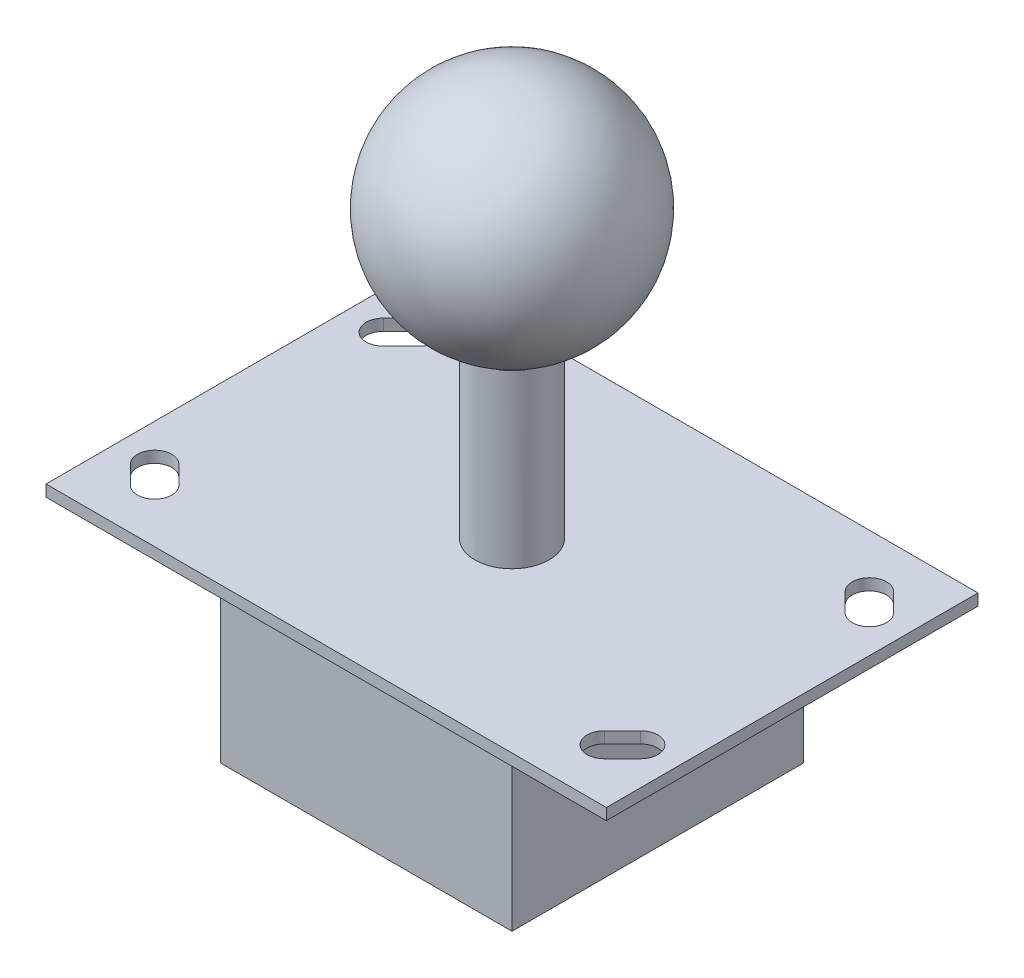
ISO-10303-21;
HEADER;
FILE_DESCRIPTION(('STEP AP214'),'2;1');
FILE_NAME('part.step','',(''),(''),'','','');
FILE_SCHEMA(('AUTOMOTIVE_DESIGN { 1 0 10303 214 1 1 1 1 }'));
ENDSEC;
DATA;
#1=APPLICATION_CONTEXT('core data for automotive mechanical design processes');
#2=APPLICATION_PROTOCOL_DEFINITION('international standard','automotive_design',2000,#1);
#3=PRODUCT_CONTEXT('',#1,'mechanical');
#4=PRODUCT('Part','Part','',(#3));
#5=PRODUCT_RELATED_PRODUCT_CATEGORY('part','',(#4));
#6=PRODUCT_DEFINITION_FORMATION('','',#4);
#7=PRODUCT_DEFINITION_CONTEXT('part definition',#1,'design');
#8=PRODUCT_DEFINITION('design','',#6,#7);
#9=PRODUCT_DEFINITION_SHAPE('','',#8);
#10=(LENGTH_UNIT() NAMED_UNIT(*) SI_UNIT(.MILLI.,.METRE.));
#11=(NAMED_UNIT(*) PLANE_ANGLE_UNIT() SI_UNIT($,.RADIAN.));
#12=(NAMED_UNIT(*) SI_UNIT($,.STERADIAN.) SOLID_ANGLE_UNIT());
#13=UNCERTAINTY_MEASURE_WITH_UNIT(LENGTH_MEASURE(1.E-05),#10,'distance_accuracy_value','');
#14=(GEOMETRIC_REPRESENTATION_CONTEXT(3) GLOBAL_UNCERTAINTY_ASSIGNED_CONTEXT((#13)) GLOBAL_UNIT_ASSIGNED_CONTEXT((#10,
#11,#12)) REPRESENTATION_CONTEXT('',''));
#15=CARTESIAN_POINT('',(0.,0.,0.));
#16=DIRECTION('',(0.,0.,1.));
#17=DIRECTION('',(1.,0.,0.));
#18=AXIS2_PLACEMENT_3D('',#15,#16,#17);
#19=CARTESIAN_POINT('',(0.,50.,0.));
#20=DIRECTION('',(0.,-1.,0.));
#21=DIRECTION('',(-1.,0.,0.));
#22=AXIS2_PLACEMENT_3D('',#19,#20,#21);
#23=SPHERICAL_SURFACE('',#22,20.);
#24=CARTESIAN_POINT('',(0.,30.,0.));
#25=VERTEX_POINT('',#24);
#26=VERTEX_LOOP('',#25);
#27=FACE_BOUND('',#26,.T.);
#28=ADVANCED_FACE('F40',(#27),#23,.T.);
#29=CLOSED_SHELL('',(#28));
#30=MANIFOLD_SOLID_BREP('B2',#29);
#31=CARTESIAN_POINT('',(0.,-2.,0.));
#32=DIRECTION('',(0.,-1.,0.));
#33=DIRECTION('',(0.,0.,-1.));
#34=AXIS2_PLACEMENT_3D('',#31,#32,#33);
#35=PLANE('',#34);
#36=CARTESIAN_POINT('',(-39.3180194846605,-2.,23.1819805153395));
#37=DIRECTION('',(0.,-1.,0.));
#38=DIRECTION('',(0.,0.,-1.));
#39=AXIS2_PLACEMENT_3D('',#36,#37,#38);
#40=CIRCLE('',#39,3.);
#41=CARTESIAN_POINT('',(-37.1966991411009,-2.,21.0606601717798));
#42=VERTEX_POINT('',#41);
#43=CARTESIAN_POINT('',(-41.4393398282202,-2.,25.3033008588991));
#44=VERTEX_POINT('',#43);
#45=EDGE_CURVE('E304',#42,#44,#40,.T.);
#46=ORIENTED_EDGE('',*,*,#45,.F.);
#47=DIRECTION('',(0.707106781186549,0.,0.707106781186546));
#48=VECTOR('',#47,1.);
#49=CARTESIAN_POINT('',(-29.1286796564403,-2.,29.1286796564404));
#50=LINE('',#49,#48);
#51=CARTESIAN_POINT('',(-40.3786796564404,-2.,17.8786796564404));
#52=VERTEX_POINT('',#51);
#53=EDGE_CURVE('E299',#52,#42,#50,.T.);
#54=ORIENTED_EDGE('',*,*,#53,.F.);
#55=CARTESIAN_POINT('',(-42.5,-2.,20.));
#56=DIRECTION('',(0.,-1.,0.));
#57=DIRECTION('',(0.,0.,-1.));
#58=AXIS2_PLACEMENT_3D('',#55,#56,#57);
#59=CIRCLE('',#58,3.);
#60=CARTESIAN_POINT('',(-44.6213203435596,-2.,22.1213203435597));
#61=VERTEX_POINT('',#60);
#62=EDGE_CURVE('E218',#61,#52,#59,.T.);
#63=ORIENTED_EDGE('',*,*,#62,.F.);
#64=DIRECTION('',(-0.70710678118655,0.,-0.707106781186545));
#65=VECTOR('',#64,1.);
#66=CARTESIAN_POINT('',(-33.3713203435595,-2.,33.3713203435597));
#67=LINE('',#66,#65);
#68=EDGE_CURVE('E302',#44,#61,#67,.T.);
#69=ORIENTED_EDGE('',*,*,#68,.F.);
#70=EDGE_LOOP('',(#46,#54,#63,#69));
#71=FACE_BOUND('',#70,.T.);
#72=CARTESIAN_POINT('',(39.3180194846605,-2.,23.1819805153394));
#73=DIRECTION('',(0.,-1.,0.));
#74=DIRECTION('',(0.,0.,-1.));
#75=AXIS2_PLACEMENT_3D('',#72,#73,#74);
#76=CIRCLE('',#75,3.);
#77=CARTESIAN_POINT('',(41.4393398282202,-2.,25.3033008588991));
#78=VERTEX_POINT('',#77);
#79=CARTESIAN_POINT('',(37.1966991411009,-2.,21.0606601717798));
#80=VERTEX_POINT('',#79);
#81=EDGE_CURVE('E297',#78,#80,#76,.T.);
#82=ORIENTED_EDGE('',*,*,#81,.F.);
#83=DIRECTION('',(-0.70710678118655,0.,0.707106781186545));
#84=VECTOR('',#83,1.);
#85=CARTESIAN_POINT('',(33.3713203435595,-2.,33.3713203435597));
#86=LINE('',#85,#84);
#87=CARTESIAN_POINT('',(44.6213203435596,-2.,22.1213203435596));
#88=VERTEX_POINT('',#87);
#89=EDGE_CURVE('E291',#88,#78,#86,.T.);
#90=ORIENTED_EDGE('',*,*,#89,.F.);
#91=CARTESIAN_POINT('',(42.5,-2.,20.));
#92=DIRECTION('',(0.,-1.,0.));
#93=DIRECTION('',(0.,0.,-1.));
#94=AXIS2_PLACEMENT_3D('',#91,#92,#93);
#95=CIRCLE('',#94,3.);
#96=CARTESIAN_POINT('',(40.3786796564404,-2.,17.8786796564404));
#97=VERTEX_POINT('',#96);
#98=EDGE_CURVE('E293',#97,#88,#95,.T.);
#99=ORIENTED_EDGE('',*,*,#98,.F.);
#100=DIRECTION('',(0.707106781186549,0.,-0.707106781186546));
#101=VECTOR('',#100,1.);
#102=CARTESIAN_POINT('',(29.1286796564403,-2.,29.1286796564404));
#103=LINE('',#102,#101);
#104=EDGE_CURVE('E295',#80,#97,#103,.T.);
#105=ORIENTED_EDGE('',*,*,#104,.F.);
#106=EDGE_LOOP('',(#82,#90,#99,#105));
#107=FACE_BOUND('',#106,.T.);
#108=CARTESIAN_POINT('',(42.5,-2.,-20.));
#109=DIRECTION('',(0.,-1.,0.));
#110=DIRECTION('',(0.,0.,-1.));
#111=AXIS2_PLACEMENT_3D('',#108,#109,#110);
#112=CIRCLE('',#111,3.);
#113=CARTESIAN_POINT('',(44.6213203435597,-2.,-22.1213203435596));
#114=VERTEX_POINT('',#113);
#115=CARTESIAN_POINT('',(40.3786796564404,-2.,-17.8786796564404));
#116=VERTEX_POINT('',#115);
#117=EDGE_CURVE('E289',#114,#116,#112,.T.);
#118=ORIENTED_EDGE('',*,*,#117,.F.);
#119=DIRECTION('',(0.70710678118655,0.,0.707106781186545));
#120=VECTOR('',#119,1.);
#121=CARTESIAN_POINT('',(33.3713203435595,-2.,-33.3713203435597));
#122=LINE('',#121,#120);
#123=CARTESIAN_POINT('',(41.4393398282202,-2.,-25.3033008588991));
#124=VERTEX_POINT('',#123);
#125=EDGE_CURVE('E242',#124,#114,#122,.T.);
#126=ORIENTED_EDGE('',*,*,#125,.F.);
#127=CARTESIAN_POINT('',(39.3180194846605,-2.,-23.1819805153394));
#128=DIRECTION('',(0.,-1.,0.));
#129=DIRECTION('',(0.,0.,-1.));
#130=AXIS2_PLACEMENT_3D('',#127,#128,#129);
#131=CIRCLE('',#130,3.);
#132=CARTESIAN_POINT('',(37.1966991411009,-2.,-21.0606601717798));
#133=VERTEX_POINT('',#132);
#134=EDGE_CURVE('E284',#133,#124,#131,.T.);
#135=ORIENTED_EDGE('',*,*,#134,.F.);
#136=DIRECTION('',(-0.707106781186549,0.,-0.707106781186546));
#137=VECTOR('',#136,1.);
#138=CARTESIAN_POINT('',(29.1286796564403,-2.,-29.1286796564404));
#139=LINE('',#138,#137);
#140=EDGE_CURVE('E287',#116,#133,#139,.T.);
#141=ORIENTED_EDGE('',*,*,#140,.F.);
#142=EDGE_LOOP('',(#118,#126,#135,#141));
#143=FACE_BOUND('',#142,.T.);
#144=CARTESIAN_POINT('',(-42.5,-2.,-20.));
#145=DIRECTION('',(0.,-1.,0.));
#146=DIRECTION('',(0.,0.,-1.));
#147=AXIS2_PLACEMENT_3D('',#144,#145,#146);
#148=CIRCLE('',#147,3.);
#149=CARTESIAN_POINT('',(-40.3786796564404,-2.,-17.8786796564404));
#150=VERTEX_POINT('',#149);
#151=CARTESIAN_POINT('',(-44.6213203435596,-2.,-22.1213203435596));
#152=VERTEX_POINT('',#151);
#153=EDGE_CURVE('E333',#150,#152,#148,.T.);
#154=ORIENTED_EDGE('',*,*,#153,.F.);
#155=DIRECTION('',(-0.707106781186549,0.,0.707106781186546));
#156=VECTOR('',#155,1.);
#157=CARTESIAN_POINT('',(-29.1286796564403,-2.,-29.1286796564404));
#158=LINE('',#157,#156);
#159=CARTESIAN_POINT('',(-37.1966991411009,-2.,-21.0606601717798));
#160=VERTEX_POINT('',#159);
#161=EDGE_CURVE('E320',#160,#150,#158,.T.);
#162=ORIENTED_EDGE('',*,*,#161,.F.);
#163=CARTESIAN_POINT('',(-39.3180194846605,-2.,-23.1819805153395));
#164=DIRECTION('',(0.,-1.,0.));
#165=DIRECTION('',(0.,0.,-1.));
#166=AXIS2_PLACEMENT_3D('',#163,#164,#165);
#167=CIRCLE('',#166,3.);
#168=CARTESIAN_POINT('',(-41.4393398282202,-2.,-25.3033008588991));
#169=VERTEX_POINT('',#168);
#170=EDGE_CURVE('E328',#169,#160,#167,.T.);
#171=ORIENTED_EDGE('',*,*,#170,.F.);
#172=DIRECTION('',(0.70710678118655,0.,-0.707106781186545));
#173=VECTOR('',#172,1.);
#174=CARTESIAN_POINT('',(-33.3713203435595,-2.,-33.3713203435597));
#175=LINE('',#174,#173);
#176=EDGE_CURVE('E331',#152,#169,#175,.T.);
#177=ORIENTED_EDGE('',*,*,#176,.F.);
#178=EDGE_LOOP('',(#154,#162,#171,#177));
#179=FACE_BOUND('',#178,.T.);
#180=DIRECTION('',(0.,0.,1.));
#181=VECTOR('',#180,1.);
#182=CARTESIAN_POINT('',(49.,-2.,-32.5));
#183=LINE('',#182,#181);
#184=CARTESIAN_POINT('',(49.,-2.,-32.5));
#185=VERTEX_POINT('',#184);
#186=CARTESIAN_POINT('',(49.,-2.,32.5));
#187=VERTEX_POINT('',#186);
#188=EDGE_CURVE('E365',#185,#187,#183,.T.);
#189=ORIENTED_EDGE('',*,*,#188,.T.);
#190=DIRECTION('',(-1.,0.,0.));
#191=VECTOR('',#190,1.);
#192=CARTESIAN_POINT('',(49.,-2.,32.5));
#193=LINE('',#192,#191);
#194=CARTESIAN_POINT('',(-49.,-2.,32.5));
#195=VERTEX_POINT('',#194);
#196=EDGE_CURVE('E368',#187,#195,#193,.T.);
#197=ORIENTED_EDGE('',*,*,#196,.T.);
#198=DIRECTION('',(0.,0.,-1.));
#199=VECTOR('',#198,1.);
#200=CARTESIAN_POINT('',(-49.,-2.,-32.5));
#201=LINE('',#200,#199);
#202=CARTESIAN_POINT('',(-49.,-2.,-32.5));
#203=VERTEX_POINT('',#202);
#204=EDGE_CURVE('E371',#195,#203,#201,.T.);
#205=ORIENTED_EDGE('',*,*,#204,.T.);
#206=DIRECTION('',(1.,0.,0.));
#207=VECTOR('',#206,1.);
#208=CARTESIAN_POINT('',(49.,-2.,-32.5));
#209=LINE('',#208,#207);
#210=EDGE_CURVE('E373',#203,#185,#209,.T.);
#211=ORIENTED_EDGE('',*,*,#210,.T.);
#212=EDGE_LOOP('',(#189,#197,#205,#211));
#213=FACE_BOUND('',#212,.T.);
#214=DIRECTION('',(1.,0.,0.));
#215=VECTOR('',#214,1.);
#216=CARTESIAN_POINT('',(-25.5,-2.,-25.5));
#217=LINE('',#216,#215);
#218=CARTESIAN_POINT('',(-25.5,-2.,-25.5));
#219=VERTEX_POINT('',#218);
#220=CARTESIAN_POINT('',(25.5,-2.,-25.5));
#221=VERTEX_POINT('',#220);
#222=EDGE_CURVE('E349',#219,#221,#217,.T.);
#223=ORIENTED_EDGE('',*,*,#222,.F.);
#224=DIRECTION('',(0.,0.,-1.));
#225=VECTOR('',#224,1.);
#226=CARTESIAN_POINT('',(-25.5,-2.,25.5));
#227=LINE('',#226,#225);
#228=CARTESIAN_POINT('',(-25.5,-2.,25.5));
#229=VERTEX_POINT('',#228);
#230=EDGE_CURVE('E335',#229,#219,#227,.T.);
#231=ORIENTED_EDGE('',*,*,#230,.F.);
#232=DIRECTION('',(-1.,0.,0.));
#233=VECTOR('',#232,1.);
#234=CARTESIAN_POINT('',(-25.5,-2.,25.5));
#235=LINE('',#234,#233);
#236=CARTESIAN_POINT('',(25.5,-2.,25.5));
#237=VERTEX_POINT('',#236);
#238=EDGE_CURVE('E340',#237,#229,#235,.T.);
#239=ORIENTED_EDGE('',*,*,#238,.F.);
#240=DIRECTION('',(0.,0.,1.));
#241=VECTOR('',#240,1.);
#242=CARTESIAN_POINT('',(25.5,-2.,25.5));
#243=LINE('',#242,#241);
#244=EDGE_CURVE('E351',#221,#237,#243,.T.);
#245=ORIENTED_EDGE('',*,*,#244,.F.);
#246=EDGE_LOOP('',(#223,#231,#239,#245));
#247=FACE_BOUND('',#246,.T.);
#248=ADVANCED_FACE('F52',(#71,#107,#143,#179,#213,#247),#35,.T.);
#249=CARTESIAN_POINT('',(0.,30.,0.));
#250=DIRECTION('',(0.,-1.,0.));
#251=DIRECTION('',(0.,0.,-1.));
#252=AXIS2_PLACEMENT_3D('',#249,#250,#251);
#253=CYLINDRICAL_SURFACE('',#252,6.5);
#254=CARTESIAN_POINT('',(0.,30.,0.));
#255=DIRECTION('',(0.,1.,0.));
#256=DIRECTION('',(0.,0.,1.));
#257=AXIS2_PLACEMENT_3D('',#254,#255,#256);
#258=CIRCLE('',#257,6.5);
#259=CARTESIAN_POINT('',(0.,30.,6.5));
#260=VERTEX_POINT('',#259);
#261=EDGE_CURVE('E38',#260,#260,#258,.T.);
#262=ORIENTED_EDGE('',*,*,#261,.F.);
#263=EDGE_LOOP('',(#262));
#264=FACE_BOUND('',#263,.T.);
#265=CARTESIAN_POINT('',(0.,0.,0.));
#266=DIRECTION('',(0.,-1.,0.));
#267=DIRECTION('',(0.,0.,-1.));
#268=AXIS2_PLACEMENT_3D('',#265,#266,#267);
#269=CIRCLE('',#268,6.5);
#270=CARTESIAN_POINT('',(0.,0.,-6.5));
#271=VERTEX_POINT('',#270);
#272=EDGE_CURVE('E60',#271,#271,#269,.T.);
#273=ORIENTED_EDGE('',*,*,#272,.F.);
#274=EDGE_LOOP('',(#273));
#275=FACE_BOUND('',#274,.T.);
#276=ADVANCED_FACE('F54',(#264,#275),#253,.T.);
#277=CARTESIAN_POINT('',(0.,30.,0.));
#278=DIRECTION('',(0.,1.,0.));
#279=DIRECTION('',(0.,0.,1.));
#280=AXIS2_PLACEMENT_3D('',#277,#278,#279);
#281=PLANE('',#280);
#282=ORIENTED_EDGE('',*,*,#261,.T.);
#283=EDGE_LOOP('',(#282));
#284=FACE_BOUND('',#283,.T.);
#285=ADVANCED_FACE('F399',(#284),#281,.T.);
#286=CARTESIAN_POINT('',(49.,-2.,-32.5));
#287=DIRECTION('',(-1.,0.,0.));
#288=DIRECTION('',(0.,0.,1.));
#289=AXIS2_PLACEMENT_3D('',#286,#287,#288);
#290=PLANE('',#289);
#291=DIRECTION('',(0.,0.,1.));
#292=VECTOR('',#291,1.);
#293=CARTESIAN_POINT('',(49.,0.,-32.5));
#294=LINE('',#293,#292);
#295=CARTESIAN_POINT('',(49.,0.,-32.5));
#296=VERTEX_POINT('',#295);
#297=CARTESIAN_POINT('',(49.,0.,32.5));
#298=VERTEX_POINT('',#297);
#299=EDGE_CURVE('E364',#296,#298,#294,.T.);
#300=ORIENTED_EDGE('',*,*,#299,.T.);
#301=DIRECTION('',(0.,1.,0.));
#302=VECTOR('',#301,1.);
#303=CARTESIAN_POINT('',(49.,-2.,32.5));
#304=LINE('',#303,#302);
#305=EDGE_CURVE('E391',#187,#298,#304,.T.);
#306=ORIENTED_EDGE('',*,*,#305,.F.);
#307=ORIENTED_EDGE('',*,*,#188,.F.);
#308=DIRECTION('',(0.,1.,0.));
#309=VECTOR('',#308,1.);
#310=CARTESIAN_POINT('',(49.,-2.,-32.5));
#311=LINE('',#310,#309);
#312=EDGE_CURVE('E375',#185,#296,#311,.T.);
#313=ORIENTED_EDGE('',*,*,#312,.T.);
#314=EDGE_LOOP('',(#300,#306,#307,#313));
#315=FACE_BOUND('',#314,.T.);
#316=ADVANCED_FACE('F405',(#315),#290,.F.);
#317=CARTESIAN_POINT('',(49.,-2.,32.5));
#318=DIRECTION('',(0.,0.,-1.));
#319=DIRECTION('',(-1.,0.,0.));
#320=AXIS2_PLACEMENT_3D('',#317,#318,#319);
#321=PLANE('',#320);
#322=DIRECTION('',(-1.,0.,0.));
#323=VECTOR('',#322,1.);
#324=CARTESIAN_POINT('',(49.,0.,32.5));
#325=LINE('',#324,#323);
#326=CARTESIAN_POINT('',(-49.,0.,32.5));
#327=VERTEX_POINT('',#326);
#328=EDGE_CURVE('E378',#298,#327,#325,.T.);
#329=ORIENTED_EDGE('',*,*,#328,.T.);
#330=DIRECTION('',(0.,1.,0.));
#331=VECTOR('',#330,1.);
#332=CARTESIAN_POINT('',(-49.,-2.,32.5));
#333=LINE('',#332,#331);
#334=EDGE_CURVE('E388',#195,#327,#333,.T.);
#335=ORIENTED_EDGE('',*,*,#334,.F.);
#336=ORIENTED_EDGE('',*,*,#196,.F.);
#337=ORIENTED_EDGE('',*,*,#305,.T.);
#338=EDGE_LOOP('',(#329,#335,#336,#337));
#339=FACE_BOUND('',#338,.T.);
#340=ADVANCED_FACE('F427',(#339),#321,.F.);
#341=CARTESIAN_POINT('',(-49.,-2.,-32.5));
#342=DIRECTION('',(1.,0.,0.));
#343=DIRECTION('',(0.,0.,-1.));
#344=AXIS2_PLACEMENT_3D('',#341,#342,#343);
#345=PLANE('',#344);
#346=DIRECTION('',(0.,0.,-1.));
#347=VECTOR('',#346,1.);
#348=CARTESIAN_POINT('',(-49.,0.,-32.5));
#349=LINE('',#348,#347);
#350=CARTESIAN_POINT('',(-49.,0.,-32.5));
#351=VERTEX_POINT('',#350);
#352=EDGE_CURVE('E380',#327,#351,#349,.T.);
#353=ORIENTED_EDGE('',*,*,#352,.T.);
#354=DIRECTION('',(0.,1.,0.));
#355=VECTOR('',#354,1.);
#356=CARTESIAN_POINT('',(-49.,-2.,-32.5));
#357=LINE('',#356,#355);
#358=EDGE_CURVE('E385',#203,#351,#357,.T.);
#359=ORIENTED_EDGE('',*,*,#358,.F.);
#360=ORIENTED_EDGE('',*,*,#204,.F.);
#361=ORIENTED_EDGE('',*,*,#334,.T.);
#362=EDGE_LOOP('',(#353,#359,#360,#361));
#363=FACE_BOUND('',#362,.T.);
#364=ADVANCED_FACE('F423',(#363),#345,.F.);
#365=CARTESIAN_POINT('',(49.,-2.,-32.5));
#366=DIRECTION('',(0.,0.,1.));
#367=DIRECTION('',(1.,0.,0.));
#368=AXIS2_PLACEMENT_3D('',#365,#366,#367);
#369=PLANE('',#368);
#370=DIRECTION('',(1.,0.,0.));
#371=VECTOR('',#370,1.);
#372=CARTESIAN_POINT('',(49.,0.,-32.5));
#373=LINE('',#372,#371);
#374=EDGE_CURVE('E369',#351,#296,#373,.T.);
#375=ORIENTED_EDGE('',*,*,#374,.T.);
#376=ORIENTED_EDGE('',*,*,#312,.F.);
#377=ORIENTED_EDGE('',*,*,#210,.F.);
#378=ORIENTED_EDGE('',*,*,#358,.T.);
#379=EDGE_LOOP('',(#375,#376,#377,#378));
#380=FACE_BOUND('',#379,.T.);
#381=ADVANCED_FACE('F420',(#380),#369,.F.);
#382=CARTESIAN_POINT('',(0.,0.,0.));
#383=DIRECTION('',(0.,-1.,0.));
#384=DIRECTION('',(0.,0.,-1.));
#385=AXIS2_PLACEMENT_3D('',#382,#383,#384);
#386=PLANE('',#385);
#387=DIRECTION('',(-0.707106781186549,0.,-0.707106781186546));
#388=VECTOR('',#387,1.);
#389=CARTESIAN_POINT('',(-40.3786796564404,0.,17.8786796564404));
#390=LINE('',#389,#388);
#391=CARTESIAN_POINT('',(-37.1966991411009,0.,21.0606601717798));
#392=VERTEX_POINT('',#391);
#393=CARTESIAN_POINT('',(-40.3786796564404,0.,17.8786796564404));
#394=VERTEX_POINT('',#393);
#395=EDGE_CURVE('E225',#392,#394,#390,.T.);
#396=ORIENTED_EDGE('',*,*,#395,.F.);
#397=CARTESIAN_POINT('',(-39.3180194846605,0.,23.1819805153395));
#398=DIRECTION('',(0.,1.,0.));
#399=DIRECTION('',(0.,0.,-1.));
#400=AXIS2_PLACEMENT_3D('',#397,#398,#399);
#401=CIRCLE('',#400,3.);
#402=CARTESIAN_POINT('',(-41.4393398282202,0.,25.3033008588991));
#403=VERTEX_POINT('',#402);
#404=EDGE_CURVE('E230',#403,#392,#401,.T.);
#405=ORIENTED_EDGE('',*,*,#404,.F.);
#406=DIRECTION('',(0.70710678118655,0.,0.707106781186545));
#407=VECTOR('',#406,1.);
#408=CARTESIAN_POINT('',(-44.6213203435596,0.,22.1213203435596));
#409=LINE('',#408,#407);
#410=CARTESIAN_POINT('',(-44.6213203435596,0.,22.1213203435597));
#411=VERTEX_POINT('',#410);
#412=EDGE_CURVE('E235',#411,#403,#409,.T.);
#413=ORIENTED_EDGE('',*,*,#412,.F.);
#414=CARTESIAN_POINT('',(-42.5,0.,20.));
#415=DIRECTION('',(0.,1.,0.));
#416=DIRECTION('',(0.,0.,-1.));
#417=AXIS2_PLACEMENT_3D('',#414,#415,#416);
#418=CIRCLE('',#417,3.);
#419=EDGE_CURVE('E215',#394,#411,#418,.T.);
#420=ORIENTED_EDGE('',*,*,#419,.F.);
#421=EDGE_LOOP('',(#396,#405,#413,#420));
#422=FACE_BOUND('',#421,.T.);
#423=DIRECTION('',(0.70710678118655,0.,-0.707106781186545));
#424=VECTOR('',#423,1.);
#425=CARTESIAN_POINT('',(44.6213203435597,0.,22.1213203435596));
#426=LINE('',#425,#424);
#427=CARTESIAN_POINT('',(41.4393398282202,0.,25.3033008588991));
#428=VERTEX_POINT('',#427);
#429=CARTESIAN_POINT('',(44.6213203435597,0.,22.1213203435596));
#430=VERTEX_POINT('',#429);
#431=EDGE_CURVE('E247',#428,#430,#426,.T.);
#432=ORIENTED_EDGE('',*,*,#431,.F.);
#433=CARTESIAN_POINT('',(39.3180194846605,0.,23.1819805153394));
#434=DIRECTION('',(0.,1.,0.));
#435=DIRECTION('',(0.,0.,1.));
#436=AXIS2_PLACEMENT_3D('',#433,#434,#435);
#437=CIRCLE('',#436,3.);
#438=CARTESIAN_POINT('',(37.1966991411009,0.,21.0606601717798));
#439=VERTEX_POINT('',#438);
#440=EDGE_CURVE('E245',#439,#428,#437,.T.);
#441=ORIENTED_EDGE('',*,*,#440,.F.);
#442=DIRECTION('',(-0.707106781186549,0.,0.707106781186546));
#443=VECTOR('',#442,1.);
#444=CARTESIAN_POINT('',(40.3786796564404,0.,17.8786796564404));
#445=LINE('',#444,#443);
#446=CARTESIAN_POINT('',(40.3786796564404,0.,17.8786796564404));
#447=VERTEX_POINT('',#446);
#448=EDGE_CURVE('E253',#447,#439,#445,.T.);
#449=ORIENTED_EDGE('',*,*,#448,.F.);
#450=CARTESIAN_POINT('',(42.5,0.,20.));
#451=DIRECTION('',(0.,1.,0.));
#452=DIRECTION('',(0.,0.,1.));
#453=AXIS2_PLACEMENT_3D('',#450,#451,#452);
#454=CIRCLE('',#453,3.);
#455=EDGE_CURVE('E250',#430,#447,#454,.T.);
#456=ORIENTED_EDGE('',*,*,#455,.F.);
#457=EDGE_LOOP('',(#432,#441,#449,#456));
#458=FACE_BOUND('',#457,.T.);
#459=DIRECTION('',(-0.70710678118655,0.,-0.707106781186545));
#460=VECTOR('',#459,1.);
#461=CARTESIAN_POINT('',(44.6213203435597,0.,-22.1213203435596));
#462=LINE('',#461,#460);
#463=CARTESIAN_POINT('',(44.6213203435596,0.,-22.1213203435596));
#464=VERTEX_POINT('',#463);
#465=CARTESIAN_POINT('',(41.4393398282202,0.,-25.3033008588991));
#466=VERTEX_POINT('',#465);
#467=EDGE_CURVE('E266',#464,#466,#462,.T.);
#468=ORIENTED_EDGE('',*,*,#467,.F.);
#469=CARTESIAN_POINT('',(42.5,0.,-20.));
#470=DIRECTION('',(0.,1.,0.));
#471=DIRECTION('',(0.,0.,-1.));
#472=AXIS2_PLACEMENT_3D('',#469,#470,#471);
#473=CIRCLE('',#472,3.);
#474=CARTESIAN_POINT('',(40.3786796564404,0.,-17.8786796564404));
#475=VERTEX_POINT('',#474);
#476=EDGE_CURVE('E264',#475,#464,#473,.T.);
#477=ORIENTED_EDGE('',*,*,#476,.F.);
#478=DIRECTION('',(0.707106781186549,0.,0.707106781186546));
#479=VECTOR('',#478,1.);
#480=CARTESIAN_POINT('',(40.3786796564404,0.,-17.8786796564404));
#481=LINE('',#480,#479);
#482=CARTESIAN_POINT('',(37.1966991411009,0.,-21.0606601717798));
#483=VERTEX_POINT('',#482);
#484=EDGE_CURVE('E272',#483,#475,#481,.T.);
#485=ORIENTED_EDGE('',*,*,#484,.F.);
#486=CARTESIAN_POINT('',(39.3180194846605,0.,-23.1819805153394));
#487=DIRECTION('',(0.,1.,0.));
#488=DIRECTION('',(0.,0.,-1.));
#489=AXIS2_PLACEMENT_3D('',#486,#487,#488);
#490=CIRCLE('',#489,3.);
#491=EDGE_CURVE('E269',#466,#483,#490,.T.);
#492=ORIENTED_EDGE('',*,*,#491,.F.);
#493=EDGE_LOOP('',(#468,#477,#485,#492));
#494=FACE_BOUND('',#493,.T.);
#495=DIRECTION('',(0.707106781186549,0.,-0.707106781186546));
#496=VECTOR('',#495,1.);
#497=CARTESIAN_POINT('',(-40.3786796564404,0.,-17.8786796564404));
#498=LINE('',#497,#496);
#499=CARTESIAN_POINT('',(-40.3786796564404,0.,-17.8786796564404));
#500=VERTEX_POINT('',#499);
#501=CARTESIAN_POINT('',(-37.1966991411009,0.,-21.0606601717798));
#502=VERTEX_POINT('',#501);
#503=EDGE_CURVE('E308',#500,#502,#498,.T.);
#504=ORIENTED_EDGE('',*,*,#503,.F.);
#505=CARTESIAN_POINT('',(-42.5,0.,-20.));
#506=DIRECTION('',(0.,1.,0.));
#507=DIRECTION('',(0.,0.,1.));
#508=AXIS2_PLACEMENT_3D('',#505,#506,#507);
#509=CIRCLE('',#508,3.);
#510=CARTESIAN_POINT('',(-44.6213203435596,0.,-22.1213203435596));
#511=VERTEX_POINT('',#510);
#512=EDGE_CURVE('E306',#511,#500,#509,.T.);
#513=ORIENTED_EDGE('',*,*,#512,.F.);
#514=DIRECTION('',(-0.70710678118655,0.,0.707106781186545));
#515=VECTOR('',#514,1.);
#516=CARTESIAN_POINT('',(-44.6213203435596,0.,-22.1213203435596));
#517=LINE('',#516,#515);
#518=CARTESIAN_POINT('',(-41.4393398282202,0.,-25.3033008588991));
#519=VERTEX_POINT('',#518);
#520=EDGE_CURVE('E314',#519,#511,#517,.T.);
#521=ORIENTED_EDGE('',*,*,#520,.F.);
#522=CARTESIAN_POINT('',(-39.3180194846605,0.,-23.1819805153395));
#523=DIRECTION('',(0.,1.,0.));
#524=DIRECTION('',(0.,0.,1.));
#525=AXIS2_PLACEMENT_3D('',#522,#523,#524);
#526=CIRCLE('',#525,3.);
#527=EDGE_CURVE('E311',#502,#519,#526,.T.);
#528=ORIENTED_EDGE('',*,*,#527,.F.);
#529=EDGE_LOOP('',(#504,#513,#521,#528));
#530=FACE_BOUND('',#529,.T.);
#531=ORIENTED_EDGE('',*,*,#272,.T.);
#532=EDGE_LOOP('',(#531));
#533=FACE_BOUND('',#532,.T.);
#534=ORIENTED_EDGE('',*,*,#299,.F.);
#535=ORIENTED_EDGE('',*,*,#374,.F.);
#536=ORIENTED_EDGE('',*,*,#352,.F.);
#537=ORIENTED_EDGE('',*,*,#328,.F.);
#538=EDGE_LOOP('',(#534,#535,#536,#537));
#539=FACE_BOUND('',#538,.T.);
#540=ADVANCED_FACE('F232',(#422,#458,#494,#530,#533,#539),#386,.F.);
#541=CARTESIAN_POINT('',(-25.5,-34.,25.5));
#542=DIRECTION('',(1.,0.,0.));
#543=DIRECTION('',(0.,0.,-1.));
#544=AXIS2_PLACEMENT_3D('',#541,#542,#543);
#545=PLANE('',#544);
#546=ORIENTED_EDGE('',*,*,#230,.T.);
#547=DIRECTION('',(0.,1.,0.));
#548=VECTOR('',#547,1.);
#549=CARTESIAN_POINT('',(-25.5,-34.,-25.5));
#550=LINE('',#549,#548);
#551=CARTESIAN_POINT('',(-25.5,-34.,-25.5));
#552=VERTEX_POINT('',#551);
#553=EDGE_CURVE('E362',#552,#219,#550,.T.);
#554=ORIENTED_EDGE('',*,*,#553,.F.);
#555=DIRECTION('',(0.,0.,-1.));
#556=VECTOR('',#555,1.);
#557=CARTESIAN_POINT('',(-25.5,-34.,25.5));
#558=LINE('',#557,#556);
#559=CARTESIAN_POINT('',(-25.5,-34.,25.5));
#560=VERTEX_POINT('',#559);
#561=EDGE_CURVE('E336',#560,#552,#558,.T.);
#562=ORIENTED_EDGE('',*,*,#561,.F.);
#563=DIRECTION('',(0.,1.,0.));
#564=VECTOR('',#563,1.);
#565=CARTESIAN_POINT('',(-25.5,-34.,25.5));
#566=LINE('',#565,#564);
#567=EDGE_CURVE('E346',#560,#229,#566,.T.);
#568=ORIENTED_EDGE('',*,*,#567,.T.);
#569=EDGE_LOOP('',(#546,#554,#562,#568));
#570=FACE_BOUND('',#569,.T.);
#571=ADVANCED_FACE('F416',(#570),#545,.F.);
#572=CARTESIAN_POINT('',(-25.5,-34.,-25.5));
#573=DIRECTION('',(0.,0.,1.));
#574=DIRECTION('',(1.,0.,0.));
#575=AXIS2_PLACEMENT_3D('',#572,#573,#574);
#576=PLANE('',#575);
#577=ORIENTED_EDGE('',*,*,#222,.T.);
#578=DIRECTION('',(0.,1.,0.));
#579=VECTOR('',#578,1.);
#580=CARTESIAN_POINT('',(25.5,-34.,-25.5));
#581=LINE('',#580,#579);
#582=CARTESIAN_POINT('',(25.5,-34.,-25.5));
#583=VERTEX_POINT('',#582);
#584=EDGE_CURVE('E359',#583,#221,#581,.T.);
#585=ORIENTED_EDGE('',*,*,#584,.F.);
#586=DIRECTION('',(1.,0.,0.));
#587=VECTOR('',#586,1.);
#588=CARTESIAN_POINT('',(-25.5,-34.,-25.5));
#589=LINE('',#588,#587);
#590=EDGE_CURVE('E339',#552,#583,#589,.T.);
#591=ORIENTED_EDGE('',*,*,#590,.F.);
#592=ORIENTED_EDGE('',*,*,#553,.T.);
#593=EDGE_LOOP('',(#577,#585,#591,#592));
#594=FACE_BOUND('',#593,.T.);
#595=ADVANCED_FACE('F454',(#594),#576,.F.);
#596=CARTESIAN_POINT('',(25.5,-34.,25.5));
#597=DIRECTION('',(-1.,0.,0.));
#598=DIRECTION('',(0.,0.,1.));
#599=AXIS2_PLACEMENT_3D('',#596,#597,#598);
#600=PLANE('',#599);
#601=ORIENTED_EDGE('',*,*,#244,.T.);
#602=DIRECTION('',(0.,1.,0.));
#603=VECTOR('',#602,1.);
#604=CARTESIAN_POINT('',(25.5,-34.,25.5));
#605=LINE('',#604,#603);
#606=CARTESIAN_POINT('',(25.5,-34.,25.5));
#607=VERTEX_POINT('',#606);
#608=EDGE_CURVE('E357',#607,#237,#605,.T.);
#609=ORIENTED_EDGE('',*,*,#608,.F.);
#610=DIRECTION('',(0.,0.,1.));
#611=VECTOR('',#610,1.);
#612=CARTESIAN_POINT('',(25.5,-34.,25.5));
#613=LINE('',#612,#611);
#614=EDGE_CURVE('E342',#583,#607,#613,.T.);
#615=ORIENTED_EDGE('',*,*,#614,.F.);
#616=ORIENTED_EDGE('',*,*,#584,.T.);
#617=EDGE_LOOP('',(#601,#609,#615,#616));
#618=FACE_BOUND('',#617,.T.);
#619=ADVANCED_FACE('F458',(#618),#600,.F.);
#620=CARTESIAN_POINT('',(-25.5,-34.,25.5));
#621=DIRECTION('',(0.,0.,-1.));
#622=DIRECTION('',(-1.,0.,0.));
#623=AXIS2_PLACEMENT_3D('',#620,#621,#622);
#624=PLANE('',#623);
#625=ORIENTED_EDGE('',*,*,#238,.T.);
#626=ORIENTED_EDGE('',*,*,#567,.F.);
#627=DIRECTION('',(-1.,0.,0.));
#628=VECTOR('',#627,1.);
#629=CARTESIAN_POINT('',(-25.5,-34.,25.5));
#630=LINE('',#629,#628);
#631=EDGE_CURVE('E344',#607,#560,#630,.T.);
#632=ORIENTED_EDGE('',*,*,#631,.F.);
#633=ORIENTED_EDGE('',*,*,#608,.T.);
#634=EDGE_LOOP('',(#625,#626,#632,#633));
#635=FACE_BOUND('',#634,.T.);
#636=ADVANCED_FACE('F467',(#635),#624,.F.);
#637=CARTESIAN_POINT('',(0.,-34.,0.));
#638=DIRECTION('',(0.,-1.,0.));
#639=DIRECTION('',(0.,0.,-1.));
#640=AXIS2_PLACEMENT_3D('',#637,#638,#639);
#641=PLANE('',#640);
#642=ORIENTED_EDGE('',*,*,#561,.T.);
#643=ORIENTED_EDGE('',*,*,#590,.T.);
#644=ORIENTED_EDGE('',*,*,#614,.T.);
#645=ORIENTED_EDGE('',*,*,#631,.T.);
#646=EDGE_LOOP('',(#642,#643,#644,#645));
#647=FACE_BOUND('',#646,.T.);
#648=ADVANCED_FACE('F462',(#647),#641,.T.);
#649=CARTESIAN_POINT('',(-42.5,-34.,-20.));
#650=DIRECTION('',(0.,1.,0.));
#651=DIRECTION('',(0.,0.,1.));
#652=AXIS2_PLACEMENT_3D('',#649,#650,#651);
#653=CYLINDRICAL_SURFACE('',#652,3.);
#654=ORIENTED_EDGE('',*,*,#153,.T.);
#655=DIRECTION('',(0.,1.,0.));
#656=VECTOR('',#655,1.);
#657=CARTESIAN_POINT('',(-44.6213203435596,-34.,-22.1213203435596));
#658=LINE('',#657,#656);
#659=EDGE_CURVE('E318',#152,#511,#658,.T.);
#660=ORIENTED_EDGE('',*,*,#659,.T.);
#661=ORIENTED_EDGE('',*,*,#512,.T.);
#662=DIRECTION('',(0.,1.,0.));
#663=VECTOR('',#662,1.);
#664=CARTESIAN_POINT('',(-40.3786796564404,-34.,-17.8786796564404));
#665=LINE('',#664,#663);
#666=EDGE_CURVE('E317',#150,#500,#665,.T.);
#667=ORIENTED_EDGE('',*,*,#666,.F.);
#668=EDGE_LOOP('',(#654,#660,#661,#667));
#669=FACE_BOUND('',#668,.T.);
#670=ADVANCED_FACE('F474',(#669),#653,.F.);
#671=CARTESIAN_POINT('',(-44.6213203435596,-34.,-22.1213203435596));
#672=DIRECTION('',(-0.707106781186545,0.,-0.70710678118655));
#673=DIRECTION('',(-0.70710678118655,0.,0.707106781186545));
#674=AXIS2_PLACEMENT_3D('',#671,#672,#673);
#675=PLANE('',#674);
#676=ORIENTED_EDGE('',*,*,#176,.T.);
#677=DIRECTION('',(0.,1.,0.));
#678=VECTOR('',#677,1.);
#679=CARTESIAN_POINT('',(-41.4393398282202,-34.,-25.3033008588991));
#680=LINE('',#679,#678);
#681=EDGE_CURVE('E321',#169,#519,#680,.T.);
#682=ORIENTED_EDGE('',*,*,#681,.T.);
#683=ORIENTED_EDGE('',*,*,#520,.T.);
#684=ORIENTED_EDGE('',*,*,#659,.F.);
#685=EDGE_LOOP('',(#676,#682,#683,#684));
#686=FACE_BOUND('',#685,.T.);
#687=ADVANCED_FACE('F554',(#686),#675,.F.);
#688=CARTESIAN_POINT('',(-39.3180194846605,-34.,-23.1819805153395));
#689=DIRECTION('',(0.,1.,0.));
#690=DIRECTION('',(0.,0.,1.));
#691=AXIS2_PLACEMENT_3D('',#688,#689,#690);
#692=CYLINDRICAL_SURFACE('',#691,3.);
#693=ORIENTED_EDGE('',*,*,#170,.T.);
#694=DIRECTION('',(0.,1.,0.));
#695=VECTOR('',#694,1.);
#696=CARTESIAN_POINT('',(-37.1966991411009,-34.,-21.0606601717798));
#697=LINE('',#696,#695);
#698=EDGE_CURVE('E323',#160,#502,#697,.T.);
#699=ORIENTED_EDGE('',*,*,#698,.T.);
#700=ORIENTED_EDGE('',*,*,#527,.T.);
#701=ORIENTED_EDGE('',*,*,#681,.F.);
#702=EDGE_LOOP('',(#693,#699,#700,#701));
#703=FACE_BOUND('',#702,.T.);
#704=ADVANCED_FACE('F562',(#703),#692,.F.);
#705=CARTESIAN_POINT('',(-40.3786796564404,-34.,-17.8786796564404));
#706=DIRECTION('',(0.707106781186546,0.,0.70710678118655));
#707=DIRECTION('',(0.707106781186549,0.,-0.707106781186546));
#708=AXIS2_PLACEMENT_3D('',#705,#706,#707);
#709=PLANE('',#708);
#710=ORIENTED_EDGE('',*,*,#161,.T.);
#711=ORIENTED_EDGE('',*,*,#666,.T.);
#712=ORIENTED_EDGE('',*,*,#503,.T.);
#713=ORIENTED_EDGE('',*,*,#698,.F.);
#714=EDGE_LOOP('',(#710,#711,#712,#713));
#715=FACE_BOUND('',#714,.T.);
#716=ADVANCED_FACE('F571',(#715),#709,.F.);
#717=CARTESIAN_POINT('',(42.5,-34.,-20.));
#718=DIRECTION('',(0.,1.,0.));
#719=DIRECTION('',(0.,0.,1.));
#720=AXIS2_PLACEMENT_3D('',#717,#718,#719);
#721=CYLINDRICAL_SURFACE('',#720,3.);
#722=ORIENTED_EDGE('',*,*,#117,.T.);
#723=DIRECTION('',(0.,1.,0.));
#724=VECTOR('',#723,1.);
#725=CARTESIAN_POINT('',(40.3786796564404,-34.,-17.8786796564404));
#726=LINE('',#725,#724);
#727=EDGE_CURVE('E248',#116,#475,#726,.T.);
#728=ORIENTED_EDGE('',*,*,#727,.T.);
#729=ORIENTED_EDGE('',*,*,#476,.T.);
#730=DIRECTION('',(0.,1.,0.));
#731=VECTOR('',#730,1.);
#732=CARTESIAN_POINT('',(44.6213203435597,-34.,-22.1213203435596));
#733=LINE('',#732,#731);
#734=EDGE_CURVE('E275',#114,#464,#733,.T.);
#735=ORIENTED_EDGE('',*,*,#734,.F.);
#736=EDGE_LOOP('',(#722,#728,#729,#735));
#737=FACE_BOUND('',#736,.T.);
#738=ADVANCED_FACE('F580',(#737),#721,.F.);
#739=CARTESIAN_POINT('',(40.3786796564404,-34.,-17.8786796564404));
#740=DIRECTION('',(-0.707106781186546,0.,0.70710678118655));
#741=DIRECTION('',(0.707106781186549,0.,0.707106781186546));
#742=AXIS2_PLACEMENT_3D('',#739,#740,#741);
#743=PLANE('',#742);
#744=ORIENTED_EDGE('',*,*,#140,.T.);
#745=DIRECTION('',(0.,1.,0.));
#746=VECTOR('',#745,1.);
#747=CARTESIAN_POINT('',(37.1966991411009,-34.,-21.0606601717798));
#748=LINE('',#747,#746);
#749=EDGE_CURVE('E277',#133,#483,#748,.T.);
#750=ORIENTED_EDGE('',*,*,#749,.T.);
#751=ORIENTED_EDGE('',*,*,#484,.T.);
#752=ORIENTED_EDGE('',*,*,#727,.F.);
#753=EDGE_LOOP('',(#744,#750,#751,#752));
#754=FACE_BOUND('',#753,.T.);
#755=ADVANCED_FACE('F589',(#754),#743,.F.);
#756=CARTESIAN_POINT('',(39.3180194846605,-34.,-23.1819805153394));
#757=DIRECTION('',(0.,1.,0.));
#758=DIRECTION('',(0.,0.,1.));
#759=AXIS2_PLACEMENT_3D('',#756,#757,#758);
#760=CYLINDRICAL_SURFACE('',#759,3.);
#761=ORIENTED_EDGE('',*,*,#134,.T.);
#762=DIRECTION('',(0.,1.,0.));
#763=VECTOR('',#762,1.);
#764=CARTESIAN_POINT('',(41.4393398282202,-34.,-25.3033008588991));
#765=LINE('',#764,#763);
#766=EDGE_CURVE('E279',#124,#466,#765,.T.);
#767=ORIENTED_EDGE('',*,*,#766,.T.);
#768=ORIENTED_EDGE('',*,*,#491,.T.);
#769=ORIENTED_EDGE('',*,*,#749,.F.);
#770=EDGE_LOOP('',(#761,#767,#768,#769));
#771=FACE_BOUND('',#770,.T.);
#772=ADVANCED_FACE('F598',(#771),#760,.F.);
#773=CARTESIAN_POINT('',(44.6213203435597,-34.,-22.1213203435596));
#774=DIRECTION('',(0.707106781186545,0.,-0.70710678118655));
#775=DIRECTION('',(-0.70710678118655,0.,-0.707106781186545));
#776=AXIS2_PLACEMENT_3D('',#773,#774,#775);
#777=PLANE('',#776);
#778=ORIENTED_EDGE('',*,*,#125,.T.);
#779=ORIENTED_EDGE('',*,*,#734,.T.);
#780=ORIENTED_EDGE('',*,*,#467,.T.);
#781=ORIENTED_EDGE('',*,*,#766,.F.);
#782=EDGE_LOOP('',(#778,#779,#780,#781));
#783=FACE_BOUND('',#782,.T.);
#784=ADVANCED_FACE('F607',(#783),#777,.F.);
#785=CARTESIAN_POINT('',(39.3180194846605,-34.,23.1819805153394));
#786=DIRECTION('',(0.,1.,0.));
#787=DIRECTION('',(0.,0.,1.));
#788=AXIS2_PLACEMENT_3D('',#785,#786,#787);
#789=CYLINDRICAL_SURFACE('',#788,3.);
#790=ORIENTED_EDGE('',*,*,#81,.T.);
#791=DIRECTION('',(0.,1.,0.));
#792=VECTOR('',#791,1.);
#793=CARTESIAN_POINT('',(37.1966991411009,-34.,21.0606601717798));
#794=LINE('',#793,#792);
#795=EDGE_CURVE('E257',#80,#439,#794,.T.);
#796=ORIENTED_EDGE('',*,*,#795,.T.);
#797=ORIENTED_EDGE('',*,*,#440,.T.);
#798=DIRECTION('',(0.,1.,0.));
#799=VECTOR('',#798,1.);
#800=CARTESIAN_POINT('',(41.4393398282202,-34.,25.3033008588991));
#801=LINE('',#800,#799);
#802=EDGE_CURVE('E256',#78,#428,#801,.T.);
#803=ORIENTED_EDGE('',*,*,#802,.F.);
#804=EDGE_LOOP('',(#790,#796,#797,#803));
#805=FACE_BOUND('',#804,.T.);
#806=ADVANCED_FACE('F616',(#805),#789,.F.);
#807=CARTESIAN_POINT('',(40.3786796564404,-34.,17.8786796564404));
#808=DIRECTION('',(-0.707106781186546,0.,-0.70710678118655));
#809=DIRECTION('',(-0.707106781186549,0.,0.707106781186546));
#810=AXIS2_PLACEMENT_3D('',#807,#808,#809);
#811=PLANE('',#810);
#812=ORIENTED_EDGE('',*,*,#104,.T.);
#813=DIRECTION('',(0.,1.,0.));
#814=VECTOR('',#813,1.);
#815=CARTESIAN_POINT('',(40.3786796564404,-34.,17.8786796564404));
#816=LINE('',#815,#814);
#817=EDGE_CURVE('E259',#97,#447,#816,.T.);
#818=ORIENTED_EDGE('',*,*,#817,.T.);
#819=ORIENTED_EDGE('',*,*,#448,.T.);
#820=ORIENTED_EDGE('',*,*,#795,.F.);
#821=EDGE_LOOP('',(#812,#818,#819,#820));
#822=FACE_BOUND('',#821,.T.);
#823=ADVANCED_FACE('F625',(#822),#811,.F.);
#824=CARTESIAN_POINT('',(42.5,-34.,20.));
#825=DIRECTION('',(0.,1.,0.));
#826=DIRECTION('',(0.,0.,1.));
#827=AXIS2_PLACEMENT_3D('',#824,#825,#826);
#828=CYLINDRICAL_SURFACE('',#827,3.);
#829=ORIENTED_EDGE('',*,*,#98,.T.);
#830=DIRECTION('',(0.,1.,0.));
#831=VECTOR('',#830,1.);
#832=CARTESIAN_POINT('',(44.6213203435597,-34.,22.1213203435596));
#833=LINE('',#832,#831);
#834=EDGE_CURVE('E75',#88,#430,#833,.T.);
#835=ORIENTED_EDGE('',*,*,#834,.T.);
#836=ORIENTED_EDGE('',*,*,#455,.T.);
#837=ORIENTED_EDGE('',*,*,#817,.F.);
#838=EDGE_LOOP('',(#829,#835,#836,#837));
#839=FACE_BOUND('',#838,.T.);
#840=ADVANCED_FACE('F634',(#839),#828,.F.);
#841=CARTESIAN_POINT('',(44.6213203435597,-34.,22.1213203435596));
#842=DIRECTION('',(0.707106781186545,0.,0.70710678118655));
#843=DIRECTION('',(0.70710678118655,0.,-0.707106781186545));
#844=AXIS2_PLACEMENT_3D('',#841,#842,#843);
#845=PLANE('',#844);
#846=ORIENTED_EDGE('',*,*,#89,.T.);
#847=ORIENTED_EDGE('',*,*,#802,.T.);
#848=ORIENTED_EDGE('',*,*,#431,.T.);
#849=ORIENTED_EDGE('',*,*,#834,.F.);
#850=EDGE_LOOP('',(#846,#847,#848,#849));
#851=FACE_BOUND('',#850,.T.);
#852=ADVANCED_FACE('F643',(#851),#845,.F.);
#853=CARTESIAN_POINT('',(-39.3180194846605,-34.,23.1819805153395));
#854=DIRECTION('',(0.,1.,0.));
#855=DIRECTION('',(0.,0.,1.));
#856=AXIS2_PLACEMENT_3D('',#853,#854,#855);
#857=CYLINDRICAL_SURFACE('',#856,3.);
#858=ORIENTED_EDGE('',*,*,#45,.T.);
#859=DIRECTION('',(0.,1.,0.));
#860=VECTOR('',#859,1.);
#861=CARTESIAN_POINT('',(-41.4393398282202,-34.,25.3033008588991));
#862=LINE('',#861,#860);
#863=EDGE_CURVE('E240',#44,#403,#862,.T.);
#864=ORIENTED_EDGE('',*,*,#863,.T.);
#865=ORIENTED_EDGE('',*,*,#404,.T.);
#866=DIRECTION('',(0.,1.,0.));
#867=VECTOR('',#866,1.);
#868=CARTESIAN_POINT('',(-37.1966991411009,-34.,21.0606601717798));
#869=LINE('',#868,#867);
#870=EDGE_CURVE('E221',#42,#392,#869,.T.);
#871=ORIENTED_EDGE('',*,*,#870,.F.);
#872=EDGE_LOOP('',(#858,#864,#865,#871));
#873=FACE_BOUND('',#872,.T.);
#874=ADVANCED_FACE('F652',(#873),#857,.F.);
#875=CARTESIAN_POINT('',(-44.6213203435596,-34.,22.1213203435596));
#876=DIRECTION('',(-0.707106781186545,0.,0.70710678118655));
#877=DIRECTION('',(0.70710678118655,0.,0.707106781186545));
#878=AXIS2_PLACEMENT_3D('',#875,#876,#877);
#879=PLANE('',#878);
#880=ORIENTED_EDGE('',*,*,#68,.T.);
#881=DIRECTION('',(0.,1.,0.));
#882=VECTOR('',#881,1.);
#883=CARTESIAN_POINT('',(-44.6213203435596,-34.,22.1213203435597));
#884=LINE('',#883,#882);
#885=EDGE_CURVE('E220',#61,#411,#884,.T.);
#886=ORIENTED_EDGE('',*,*,#885,.T.);
#887=ORIENTED_EDGE('',*,*,#412,.T.);
#888=ORIENTED_EDGE('',*,*,#863,.F.);
#889=EDGE_LOOP('',(#880,#886,#887,#888));
#890=FACE_BOUND('',#889,.T.);
#891=ADVANCED_FACE('F660',(#890),#879,.F.);
#892=CARTESIAN_POINT('',(-42.5,-34.,20.));
#893=DIRECTION('',(0.,1.,0.));
#894=DIRECTION('',(0.,0.,1.));
#895=AXIS2_PLACEMENT_3D('',#892,#893,#894);
#896=CYLINDRICAL_SURFACE('',#895,3.);
#897=ORIENTED_EDGE('',*,*,#62,.T.);
#898=DIRECTION('',(0.,1.,0.));
#899=VECTOR('',#898,1.);
#900=CARTESIAN_POINT('',(-40.3786796564404,-34.,17.8786796564404));
#901=LINE('',#900,#899);
#902=EDGE_CURVE('E67',#52,#394,#901,.T.);
#903=ORIENTED_EDGE('',*,*,#902,.T.);
#904=ORIENTED_EDGE('',*,*,#419,.T.);
#905=ORIENTED_EDGE('',*,*,#885,.F.);
#906=EDGE_LOOP('',(#897,#903,#904,#905));
#907=FACE_BOUND('',#906,.T.);
#908=ADVANCED_FACE('F212',(#907),#896,.F.);
#909=CARTESIAN_POINT('',(-40.3786796564404,-34.,17.8786796564404));
#910=DIRECTION('',(0.707106781186546,0.,-0.70710678118655));
#911=DIRECTION('',(-0.707106781186549,0.,-0.707106781186546));
#912=AXIS2_PLACEMENT_3D('',#909,#910,#911);
#913=PLANE('',#912);
#914=ORIENTED_EDGE('',*,*,#53,.T.);
#915=ORIENTED_EDGE('',*,*,#870,.T.);
#916=ORIENTED_EDGE('',*,*,#395,.T.);
#917=ORIENTED_EDGE('',*,*,#902,.F.);
#918=EDGE_LOOP('',(#914,#915,#916,#917));
#919=FACE_BOUND('',#918,.T.);
#920=ADVANCED_FACE('F226',(#919),#913,.F.);
#921=CLOSED_SHELL('',(#248,#276,#285,#316,#340,#364,#381,#540,#571,#595,#619,#636,#648,#670,
#687,#704,#716,#738,#755,#772,#784,#806,#823,#840,#852,#874,#891,#908,#920));
#922=MANIFOLD_SOLID_BREP('B6',#921);
#923=ADVANCED_BREP_SHAPE_REPRESENTATION('',(#18,#30,#922),#14);
#924=SHAPE_DEFINITION_REPRESENTATION(#9,#923);
ENDSEC;
END-ISO-10303-21;
